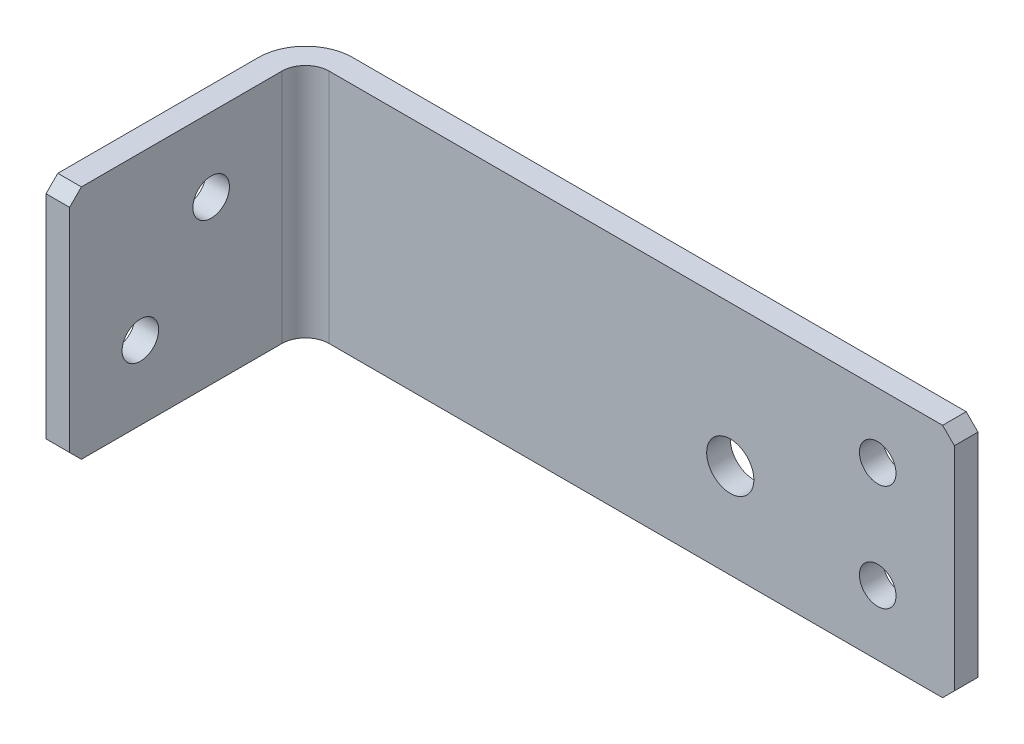
ISO-10303-21;
HEADER;
FILE_DESCRIPTION(('STEP AP214'),'2;1');
FILE_NAME('part.step','',(''),(''),'','','');
FILE_SCHEMA(('AUTOMOTIVE_DESIGN { 1 0 10303 214 1 1 1 1 }'));
ENDSEC;
DATA;
#1=APPLICATION_CONTEXT('core data for automotive mechanical design processes');
#2=APPLICATION_PROTOCOL_DEFINITION('international standard','automotive_design',2000,#1);
#3=PRODUCT_CONTEXT('',#1,'mechanical');
#4=PRODUCT('Part','Part','',(#3));
#5=PRODUCT_RELATED_PRODUCT_CATEGORY('part','',(#4));
#6=PRODUCT_DEFINITION_FORMATION('','',#4);
#7=PRODUCT_DEFINITION_CONTEXT('part definition',#1,'design');
#8=PRODUCT_DEFINITION('design','',#6,#7);
#9=PRODUCT_DEFINITION_SHAPE('','',#8);
#10=(LENGTH_UNIT() NAMED_UNIT(*) SI_UNIT(.MILLI.,.METRE.));
#11=(NAMED_UNIT(*) PLANE_ANGLE_UNIT() SI_UNIT($,.RADIAN.));
#12=(NAMED_UNIT(*) SI_UNIT($,.STERADIAN.) SOLID_ANGLE_UNIT());
#13=UNCERTAINTY_MEASURE_WITH_UNIT(LENGTH_MEASURE(1.E-05),#10,'distance_accuracy_value','');
#14=(GEOMETRIC_REPRESENTATION_CONTEXT(3) GLOBAL_UNCERTAINTY_ASSIGNED_CONTEXT((#13)) GLOBAL_UNIT_ASSIGNED_CONTEXT((#10,
#11,#12)) REPRESENTATION_CONTEXT('',''));
#15=CARTESIAN_POINT('',(0.,0.,0.));
#16=DIRECTION('',(0.,0.,1.));
#17=DIRECTION('',(1.,0.,0.));
#18=AXIS2_PLACEMENT_3D('',#15,#16,#17);
#19=CARTESIAN_POINT('',(-2.,20.,0.));
#20=DIRECTION('',(0.,0.,-1.));
#21=DIRECTION('',(-1.,0.,0.));
#22=AXIS2_PLACEMENT_3D('',#19,#20,#21);
#23=PLANE('',#22);
#24=DIRECTION('',(0.,-1.,0.));
#25=VECTOR('',#24,1.);
#26=CARTESIAN_POINT('',(-2.,20.,0.));
#27=LINE('',#26,#25);
#28=CARTESIAN_POINT('',(-2.,19.,0.));
#29=VERTEX_POINT('',#28);
#30=CARTESIAN_POINT('',(-2.,0.999999999999994,0.));
#31=VERTEX_POINT('',#30);
#32=EDGE_CURVE('E164',#29,#31,#27,.T.);
#33=ORIENTED_EDGE('',*,*,#32,.T.);
#34=DIRECTION('',(1.,0.,0.));
#35=VECTOR('',#34,1.);
#36=CARTESIAN_POINT('',(0.,0.999999999999994,0.));
#37=LINE('',#36,#35);
#38=CARTESIAN_POINT('',(0.,0.999999999999994,0.));
#39=VERTEX_POINT('',#38);
#40=EDGE_CURVE('E194',#31,#39,#37,.T.);
#41=ORIENTED_EDGE('',*,*,#40,.T.);
#42=DIRECTION('',(0.,-1.,0.));
#43=VECTOR('',#42,1.);
#44=CARTESIAN_POINT('',(0.,20.,0.));
#45=LINE('',#44,#43);
#46=CARTESIAN_POINT('',(0.,19.,0.));
#47=VERTEX_POINT('',#46);
#48=EDGE_CURVE('E147',#47,#39,#45,.T.);
#49=ORIENTED_EDGE('',*,*,#48,.F.);
#50=DIRECTION('',(-1.,0.,0.));
#51=VECTOR('',#50,1.);
#52=CARTESIAN_POINT('',(-2.,19.,0.));
#53=LINE('',#52,#51);
#54=EDGE_CURVE('E192',#47,#29,#53,.T.);
#55=ORIENTED_EDGE('',*,*,#54,.T.);
#56=EDGE_LOOP('',(#33,#41,#49,#55));
#57=FACE_BOUND('',#56,.T.);
#58=ADVANCED_FACE('F37',(#57),#23,.F.);
#59=CARTESIAN_POINT('',(0.,20.,0.));
#60=DIRECTION('',(-1.,0.,0.));
#61=DIRECTION('',(0.,0.,1.));
#62=AXIS2_PLACEMENT_3D('',#59,#60,#61);
#63=PLANE('',#62);
#64=CARTESIAN_POINT('',(0.,6.25,-6.));
#65=DIRECTION('',(-1.,0.,0.));
#66=DIRECTION('',(0.,0.,1.));
#67=AXIS2_PLACEMENT_3D('',#64,#65,#66);
#68=CIRCLE('',#67,1.55);
#69=CARTESIAN_POINT('',(0.,6.25,-4.45));
#70=VERTEX_POINT('',#69);
#71=EDGE_CURVE('E338',#70,#70,#68,.T.);
#72=ORIENTED_EDGE('',*,*,#71,.T.);
#73=EDGE_LOOP('',(#72));
#74=FACE_BOUND('',#73,.T.);
#75=CARTESIAN_POINT('',(0.,13.75,-12.));
#76=DIRECTION('',(-1.,0.,0.));
#77=DIRECTION('',(0.,0.,1.));
#78=AXIS2_PLACEMENT_3D('',#75,#76,#77);
#79=CIRCLE('',#78,1.55);
#80=CARTESIAN_POINT('',(0.,13.75,-10.45));
#81=VERTEX_POINT('',#80);
#82=EDGE_CURVE('E167',#81,#81,#79,.T.);
#83=ORIENTED_EDGE('',*,*,#82,.T.);
#84=EDGE_LOOP('',(#83));
#85=FACE_BOUND('',#84,.T.);
#86=ORIENTED_EDGE('',*,*,#48,.T.);
#87=DIRECTION('',(0.,-0.707106781186545,-0.70710678118655));
#88=VECTOR('',#87,1.);
#89=CARTESIAN_POINT('',(0.,0.999999999999994,0.));
#90=LINE('',#89,#88);
#91=CARTESIAN_POINT('',(0.,0.,-1.));
#92=VERTEX_POINT('',#91);
#93=EDGE_CURVE('E199',#39,#92,#90,.T.);
#94=ORIENTED_EDGE('',*,*,#93,.T.);
#95=DIRECTION('',(0.,0.,-1.));
#96=VECTOR('',#95,1.);
#97=CARTESIAN_POINT('',(0.,0.,0.));
#98=LINE('',#97,#96);
#99=CARTESIAN_POINT('',(0.,0.,-18.));
#100=VERTEX_POINT('',#99);
#101=EDGE_CURVE('E144',#92,#100,#98,.T.);
#102=ORIENTED_EDGE('',*,*,#101,.T.);
#103=DIRECTION('',(0.,-1.,0.));
#104=VECTOR('',#103,1.);
#105=CARTESIAN_POINT('',(0.,20.,-18.));
#106=LINE('',#105,#104);
#107=CARTESIAN_POINT('',(0.,20.,-18.));
#108=VERTEX_POINT('',#107);
#109=EDGE_CURVE('E140',#108,#100,#106,.T.);
#110=ORIENTED_EDGE('',*,*,#109,.F.);
#111=DIRECTION('',(0.,0.,-1.));
#112=VECTOR('',#111,1.);
#113=CARTESIAN_POINT('',(0.,20.,0.));
#114=LINE('',#113,#112);
#115=CARTESIAN_POINT('',(0.,20.,-0.999999999999994));
#116=VERTEX_POINT('',#115);
#117=EDGE_CURVE('E126',#116,#108,#114,.T.);
#118=ORIENTED_EDGE('',*,*,#117,.F.);
#119=DIRECTION('',(0.,0.70710678118655,-0.707106781186545));
#120=VECTOR('',#119,1.);
#121=CARTESIAN_POINT('',(0.,20.,-0.999999999999994));
#122=LINE('',#121,#120);
#123=EDGE_CURVE('E197',#116,#47,#122,.F.);
#124=ORIENTED_EDGE('',*,*,#123,.T.);
#125=EDGE_LOOP('',(#86,#94,#102,#110,#118,#124));
#126=FACE_BOUND('',#125,.T.);
#127=ADVANCED_FACE('F142',(#74,#85,#126),#63,.F.);
#128=CARTESIAN_POINT('',(2.,20.,-18.));
#129=DIRECTION('',(0.,-1.,0.));
#130=DIRECTION('',(0.,0.,-1.));
#131=AXIS2_PLACEMENT_3D('',#128,#129,#130);
#132=CYLINDRICAL_SURFACE('',#131,2.);
#133=CARTESIAN_POINT('',(2.,0.,-18.));
#134=DIRECTION('',(0.,-1.,0.));
#135=DIRECTION('',(0.,0.,-1.));
#136=AXIS2_PLACEMENT_3D('',#133,#134,#135);
#137=CIRCLE('',#136,2.);
#138=CARTESIAN_POINT('',(2.,0.,-20.));
#139=VERTEX_POINT('',#138);
#140=EDGE_CURVE('E166',#100,#139,#137,.T.);
#141=ORIENTED_EDGE('',*,*,#140,.T.);
#142=DIRECTION('',(0.,-1.,0.));
#143=VECTOR('',#142,1.);
#144=CARTESIAN_POINT('',(2.,20.,-20.));
#145=LINE('',#144,#143);
#146=CARTESIAN_POINT('',(2.,20.,-20.));
#147=VERTEX_POINT('',#146);
#148=EDGE_CURVE('E148',#147,#139,#145,.T.);
#149=ORIENTED_EDGE('',*,*,#148,.F.);
#150=CARTESIAN_POINT('',(2.,20.,-18.));
#151=DIRECTION('',(0.,-1.,0.));
#152=DIRECTION('',(0.,0.,-1.));
#153=AXIS2_PLACEMENT_3D('',#150,#151,#152);
#154=CIRCLE('',#153,2.);
#155=EDGE_CURVE('E132',#108,#147,#154,.T.);
#156=ORIENTED_EDGE('',*,*,#155,.F.);
#157=ORIENTED_EDGE('',*,*,#109,.T.);
#158=EDGE_LOOP('',(#141,#149,#156,#157));
#159=FACE_BOUND('',#158,.T.);
#160=ADVANCED_FACE('F150',(#159),#132,.F.);
#161=CARTESIAN_POINT('',(2.,20.,-20.));
#162=DIRECTION('',(0.,0.,-1.));
#163=DIRECTION('',(-1.,0.,0.));
#164=AXIS2_PLACEMENT_3D('',#161,#162,#163);
#165=PLANE('',#164);
#166=CARTESIAN_POINT('',(36.,8.,-20.));
#167=DIRECTION('',(0.,0.,-1.));
#168=DIRECTION('',(-1.,0.,0.));
#169=AXIS2_PLACEMENT_3D('',#166,#167,#168);
#170=CIRCLE('',#169,2.);
#171=CARTESIAN_POINT('',(34.,8.,-20.));
#172=VERTEX_POINT('',#171);
#173=EDGE_CURVE('E319',#172,#172,#170,.T.);
#174=ORIENTED_EDGE('',*,*,#173,.T.);
#175=EDGE_LOOP('',(#174));
#176=FACE_BOUND('',#175,.T.);
#177=CARTESIAN_POINT('',(48.5,5.5,-20.));
#178=DIRECTION('',(0.,0.,-1.));
#179=DIRECTION('',(-1.,0.,0.));
#180=AXIS2_PLACEMENT_3D('',#177,#178,#179);
#181=CIRCLE('',#180,1.55);
#182=CARTESIAN_POINT('',(46.95,5.5,-20.));
#183=VERTEX_POINT('',#182);
#184=EDGE_CURVE('E323',#183,#183,#181,.T.);
#185=ORIENTED_EDGE('',*,*,#184,.T.);
#186=EDGE_LOOP('',(#185));
#187=FACE_BOUND('',#186,.T.);
#188=CARTESIAN_POINT('',(48.5,14.5,-20.));
#189=DIRECTION('',(0.,0.,-1.));
#190=DIRECTION('',(-1.,0.,0.));
#191=AXIS2_PLACEMENT_3D('',#188,#189,#190);
#192=CIRCLE('',#191,1.55);
#193=CARTESIAN_POINT('',(46.95,14.5,-20.));
#194=VERTEX_POINT('',#193);
#195=EDGE_CURVE('E332',#194,#194,#192,.T.);
#196=ORIENTED_EDGE('',*,*,#195,.T.);
#197=EDGE_LOOP('',(#196));
#198=FACE_BOUND('',#197,.T.);
#199=DIRECTION('',(1.,0.,0.));
#200=VECTOR('',#199,1.);
#201=CARTESIAN_POINT('',(2.,0.,-20.));
#202=LINE('',#201,#200);
#203=CARTESIAN_POINT('',(54.,0.,-20.));
#204=VERTEX_POINT('',#203);
#205=EDGE_CURVE('E169',#139,#204,#202,.T.);
#206=ORIENTED_EDGE('',*,*,#205,.T.);
#207=DIRECTION('',(0.70710678118655,0.707106781186545,0.));
#208=VECTOR('',#207,1.);
#209=CARTESIAN_POINT('',(55.,0.999999999999994,-20.));
#210=LINE('',#209,#208);
#211=CARTESIAN_POINT('',(55.,0.999999999999994,-20.));
#212=VERTEX_POINT('',#211);
#213=EDGE_CURVE('E11',#204,#212,#210,.T.);
#214=ORIENTED_EDGE('',*,*,#213,.T.);
#215=DIRECTION('',(0.,-1.,0.));
#216=VECTOR('',#215,1.);
#217=CARTESIAN_POINT('',(55.,20.,-20.));
#218=LINE('',#217,#216);
#219=CARTESIAN_POINT('',(55.,19.,-20.));
#220=VERTEX_POINT('',#219);
#221=EDGE_CURVE('E188',#220,#212,#218,.T.);
#222=ORIENTED_EDGE('',*,*,#221,.F.);
#223=DIRECTION('',(0.707106781186545,-0.70710678118655,0.));
#224=VECTOR('',#223,1.);
#225=CARTESIAN_POINT('',(54.,20.,-20.));
#226=LINE('',#225,#224);
#227=CARTESIAN_POINT('',(54.,20.,-20.));
#228=VERTEX_POINT('',#227);
#229=EDGE_CURVE('E45',#220,#228,#226,.F.);
#230=ORIENTED_EDGE('',*,*,#229,.T.);
#231=DIRECTION('',(1.,0.,0.));
#232=VECTOR('',#231,1.);
#233=CARTESIAN_POINT('',(2.,20.,-20.));
#234=LINE('',#233,#232);
#235=EDGE_CURVE('E153',#147,#228,#234,.T.);
#236=ORIENTED_EDGE('',*,*,#235,.F.);
#237=ORIENTED_EDGE('',*,*,#148,.T.);
#238=EDGE_LOOP('',(#206,#214,#222,#230,#236,#237));
#239=FACE_BOUND('',#238,.T.);
#240=ADVANCED_FACE('F221',(#176,#187,#198,#239),#165,.F.);
#241=CARTESIAN_POINT('',(55.,20.,-20.));
#242=DIRECTION('',(-1.,0.,0.));
#243=DIRECTION('',(0.,0.,1.));
#244=AXIS2_PLACEMENT_3D('',#241,#242,#243);
#245=PLANE('',#244);
#246=ORIENTED_EDGE('',*,*,#221,.T.);
#247=DIRECTION('',(0.,0.,-1.));
#248=VECTOR('',#247,1.);
#249=CARTESIAN_POINT('',(55.,0.999999999999994,-22.));
#250=LINE('',#249,#248);
#251=CARTESIAN_POINT('',(55.,0.999999999999994,-22.));
#252=VERTEX_POINT('',#251);
#253=EDGE_CURVE('E214',#212,#252,#250,.T.);
#254=ORIENTED_EDGE('',*,*,#253,.T.);
#255=DIRECTION('',(0.,-1.,0.));
#256=VECTOR('',#255,1.);
#257=CARTESIAN_POINT('',(55.,20.,-22.));
#258=LINE('',#257,#256);
#259=CARTESIAN_POINT('',(55.,19.,-22.));
#260=VERTEX_POINT('',#259);
#261=EDGE_CURVE('E185',#260,#252,#258,.T.);
#262=ORIENTED_EDGE('',*,*,#261,.F.);
#263=DIRECTION('',(0.,0.,1.));
#264=VECTOR('',#263,1.);
#265=CARTESIAN_POINT('',(55.,19.,-20.));
#266=LINE('',#265,#264);
#267=EDGE_CURVE('E57',#260,#220,#266,.T.);
#268=ORIENTED_EDGE('',*,*,#267,.T.);
#269=EDGE_LOOP('',(#246,#254,#262,#268));
#270=FACE_BOUND('',#269,.T.);
#271=ADVANCED_FACE('F228',(#270),#245,.F.);
#272=CARTESIAN_POINT('',(2.,20.,-22.));
#273=DIRECTION('',(0.,0.,1.));
#274=DIRECTION('',(1.,0.,0.));
#275=AXIS2_PLACEMENT_3D('',#272,#273,#274);
#276=PLANE('',#275);
#277=CARTESIAN_POINT('',(36.,8.,-22.));
#278=DIRECTION('',(0.,0.,-1.));
#279=DIRECTION('',(-1.,0.,0.));
#280=AXIS2_PLACEMENT_3D('',#277,#278,#279);
#281=CIRCLE('',#280,2.);
#282=CARTESIAN_POINT('',(34.,8.,-22.));
#283=VERTEX_POINT('',#282);
#284=EDGE_CURVE('E316',#283,#283,#281,.T.);
#285=ORIENTED_EDGE('',*,*,#284,.F.);
#286=EDGE_LOOP('',(#285));
#287=FACE_BOUND('',#286,.T.);
#288=CARTESIAN_POINT('',(48.5,5.5,-22.));
#289=DIRECTION('',(0.,0.,-1.));
#290=DIRECTION('',(-1.,0.,0.));
#291=AXIS2_PLACEMENT_3D('',#288,#289,#290);
#292=CIRCLE('',#291,1.55);
#293=CARTESIAN_POINT('',(46.95,5.5,-22.));
#294=VERTEX_POINT('',#293);
#295=EDGE_CURVE('E320',#294,#294,#292,.T.);
#296=ORIENTED_EDGE('',*,*,#295,.F.);
#297=EDGE_LOOP('',(#296));
#298=FACE_BOUND('',#297,.T.);
#299=CARTESIAN_POINT('',(48.5,14.5,-22.));
#300=DIRECTION('',(0.,0.,-1.));
#301=DIRECTION('',(-1.,0.,0.));
#302=AXIS2_PLACEMENT_3D('',#299,#300,#301);
#303=CIRCLE('',#302,1.55);
#304=CARTESIAN_POINT('',(46.95,14.5,-22.));
#305=VERTEX_POINT('',#304);
#306=EDGE_CURVE('E329',#305,#305,#303,.T.);
#307=ORIENTED_EDGE('',*,*,#306,.F.);
#308=EDGE_LOOP('',(#307));
#309=FACE_BOUND('',#308,.T.);
#310=ORIENTED_EDGE('',*,*,#261,.T.);
#311=DIRECTION('',(-0.70710678118655,-0.707106781186545,0.));
#312=VECTOR('',#311,1.);
#313=CARTESIAN_POINT('',(55.,0.999999999999994,-22.));
#314=LINE('',#313,#312);
#315=CARTESIAN_POINT('',(54.,0.,-22.));
#316=VERTEX_POINT('',#315);
#317=EDGE_CURVE('E219',#252,#316,#314,.T.);
#318=ORIENTED_EDGE('',*,*,#317,.T.);
#319=DIRECTION('',(-1.,0.,0.));
#320=VECTOR('',#319,1.);
#321=CARTESIAN_POINT('',(2.,0.,-22.));
#322=LINE('',#321,#320);
#323=CARTESIAN_POINT('',(2.,0.,-22.));
#324=VERTEX_POINT('',#323);
#325=EDGE_CURVE('E171',#316,#324,#322,.T.);
#326=ORIENTED_EDGE('',*,*,#325,.T.);
#327=DIRECTION('',(0.,-1.,0.));
#328=VECTOR('',#327,1.);
#329=CARTESIAN_POINT('',(2.,20.,-22.));
#330=LINE('',#329,#328);
#331=CARTESIAN_POINT('',(2.,20.,-22.));
#332=VERTEX_POINT('',#331);
#333=EDGE_CURVE('E182',#332,#324,#330,.T.);
#334=ORIENTED_EDGE('',*,*,#333,.F.);
#335=DIRECTION('',(-1.,0.,0.));
#336=VECTOR('',#335,1.);
#337=CARTESIAN_POINT('',(2.,20.,-22.));
#338=LINE('',#337,#336);
#339=CARTESIAN_POINT('',(54.,20.,-22.));
#340=VERTEX_POINT('',#339);
#341=EDGE_CURVE('E155',#340,#332,#338,.T.);
#342=ORIENTED_EDGE('',*,*,#341,.F.);
#343=DIRECTION('',(-0.707106781186545,0.70710678118655,0.));
#344=VECTOR('',#343,1.);
#345=CARTESIAN_POINT('',(54.,20.,-22.));
#346=LINE('',#345,#344);
#347=EDGE_CURVE('E217',#340,#260,#346,.F.);
#348=ORIENTED_EDGE('',*,*,#347,.T.);
#349=EDGE_LOOP('',(#310,#318,#326,#334,#342,#348));
#350=FACE_BOUND('',#349,.T.);
#351=ADVANCED_FACE('F226',(#287,#298,#309,#350),#276,.F.);
#352=CARTESIAN_POINT('',(2.,20.,-18.));
#353=DIRECTION('',(0.,-1.,0.));
#354=DIRECTION('',(0.,0.,-1.));
#355=AXIS2_PLACEMENT_3D('',#352,#353,#354);
#356=CYLINDRICAL_SURFACE('',#355,4.);
#357=CARTESIAN_POINT('',(2.,0.,-18.));
#358=DIRECTION('',(0.,1.,0.));
#359=DIRECTION('',(0.,0.,-1.));
#360=AXIS2_PLACEMENT_3D('',#357,#358,#359);
#361=CIRCLE('',#360,4.);
#362=CARTESIAN_POINT('',(-2.,0.,-18.));
#363=VERTEX_POINT('',#362);
#364=EDGE_CURVE('E173',#324,#363,#361,.T.);
#365=ORIENTED_EDGE('',*,*,#364,.T.);
#366=DIRECTION('',(0.,-1.,0.));
#367=VECTOR('',#366,1.);
#368=CARTESIAN_POINT('',(-2.,20.,-18.));
#369=LINE('',#368,#367);
#370=CARTESIAN_POINT('',(-2.,20.,-18.));
#371=VERTEX_POINT('',#370);
#372=EDGE_CURVE('E179',#371,#363,#369,.T.);
#373=ORIENTED_EDGE('',*,*,#372,.F.);
#374=CARTESIAN_POINT('',(2.,20.,-18.));
#375=DIRECTION('',(0.,1.,0.));
#376=DIRECTION('',(0.,0.,-1.));
#377=AXIS2_PLACEMENT_3D('',#374,#375,#376);
#378=CIRCLE('',#377,4.);
#379=EDGE_CURVE('E160',#332,#371,#378,.T.);
#380=ORIENTED_EDGE('',*,*,#379,.F.);
#381=ORIENTED_EDGE('',*,*,#333,.T.);
#382=EDGE_LOOP('',(#365,#373,#380,#381));
#383=FACE_BOUND('',#382,.T.);
#384=ADVANCED_FACE('F241',(#383),#356,.T.);
#385=CARTESIAN_POINT('',(-2.,20.,0.));
#386=DIRECTION('',(1.,0.,0.));
#387=DIRECTION('',(0.,0.,-1.));
#388=AXIS2_PLACEMENT_3D('',#385,#386,#387);
#389=PLANE('',#388);
#390=CARTESIAN_POINT('',(-2.,6.25,-6.));
#391=DIRECTION('',(-1.,0.,0.));
#392=DIRECTION('',(0.,0.,1.));
#393=AXIS2_PLACEMENT_3D('',#390,#391,#392);
#394=CIRCLE('',#393,1.55);
#395=CARTESIAN_POINT('',(-2.,6.25,-4.45));
#396=VERTEX_POINT('',#395);
#397=EDGE_CURVE('E335',#396,#396,#394,.T.);
#398=ORIENTED_EDGE('',*,*,#397,.F.);
#399=EDGE_LOOP('',(#398));
#400=FACE_BOUND('',#399,.T.);
#401=CARTESIAN_POINT('',(-2.,13.75,-12.));
#402=DIRECTION('',(-1.,0.,0.));
#403=DIRECTION('',(0.,0.,1.));
#404=AXIS2_PLACEMENT_3D('',#401,#402,#403);
#405=CIRCLE('',#404,1.55);
#406=CARTESIAN_POINT('',(-2.,13.75,-10.45));
#407=VERTEX_POINT('',#406);
#408=EDGE_CURVE('E341',#407,#407,#405,.T.);
#409=ORIENTED_EDGE('',*,*,#408,.F.);
#410=EDGE_LOOP('',(#409));
#411=FACE_BOUND('',#410,.T.);
#412=DIRECTION('',(0.,0.,1.));
#413=VECTOR('',#412,1.);
#414=CARTESIAN_POINT('',(-2.,0.,0.));
#415=LINE('',#414,#413);
#416=CARTESIAN_POINT('',(-2.,0.,-1.));
#417=VERTEX_POINT('',#416);
#418=EDGE_CURVE('E137',#363,#417,#415,.T.);
#419=ORIENTED_EDGE('',*,*,#418,.T.);
#420=DIRECTION('',(0.,0.707106781186545,0.70710678118655));
#421=VECTOR('',#420,1.);
#422=CARTESIAN_POINT('',(-2.,0.999999999999994,0.));
#423=LINE('',#422,#421);
#424=EDGE_CURVE('E207',#417,#31,#423,.T.);
#425=ORIENTED_EDGE('',*,*,#424,.T.);
#426=ORIENTED_EDGE('',*,*,#32,.F.);
#427=DIRECTION('',(0.,-0.70710678118655,0.707106781186545));
#428=VECTOR('',#427,1.);
#429=CARTESIAN_POINT('',(-2.,20.,-0.999999999999994));
#430=LINE('',#429,#428);
#431=CARTESIAN_POINT('',(-2.,20.,-0.999999999999994));
#432=VERTEX_POINT('',#431);
#433=EDGE_CURVE('E205',#29,#432,#430,.F.);
#434=ORIENTED_EDGE('',*,*,#433,.T.);
#435=DIRECTION('',(0.,0.,1.));
#436=VECTOR('',#435,1.);
#437=CARTESIAN_POINT('',(-2.,20.,0.));
#438=LINE('',#437,#436);
#439=EDGE_CURVE('E162',#371,#432,#438,.T.);
#440=ORIENTED_EDGE('',*,*,#439,.F.);
#441=ORIENTED_EDGE('',*,*,#372,.T.);
#442=EDGE_LOOP('',(#419,#425,#426,#434,#440,#441));
#443=FACE_BOUND('',#442,.T.);
#444=ADVANCED_FACE('F245',(#400,#411,#443),#389,.F.);
#445=CARTESIAN_POINT('',(2.,20.,-18.));
#446=DIRECTION('',(0.,-1.,0.));
#447=DIRECTION('',(0.,0.,-1.));
#448=AXIS2_PLACEMENT_3D('',#445,#446,#447);
#449=PLANE('',#448);
#450=ORIENTED_EDGE('',*,*,#439,.T.);
#451=DIRECTION('',(1.,0.,0.));
#452=VECTOR('',#451,1.);
#453=CARTESIAN_POINT('',(2.,20.,-0.999999999999994));
#454=LINE('',#453,#452);
#455=EDGE_CURVE('E135',#432,#116,#454,.T.);
#456=ORIENTED_EDGE('',*,*,#455,.T.);
#457=ORIENTED_EDGE('',*,*,#117,.T.);
#458=ORIENTED_EDGE('',*,*,#155,.T.);
#459=ORIENTED_EDGE('',*,*,#235,.T.);
#460=DIRECTION('',(0.,0.,-1.));
#461=VECTOR('',#460,1.);
#462=CARTESIAN_POINT('',(54.,20.,-18.));
#463=LINE('',#462,#461);
#464=EDGE_CURVE('E209',#228,#340,#463,.T.);
#465=ORIENTED_EDGE('',*,*,#464,.T.);
#466=ORIENTED_EDGE('',*,*,#341,.T.);
#467=ORIENTED_EDGE('',*,*,#379,.T.);
#468=EDGE_LOOP('',(#450,#456,#457,#458,#459,#465,#466,#467));
#469=FACE_BOUND('',#468,.T.);
#470=ADVANCED_FACE('F129',(#469),#449,.F.);
#471=CARTESIAN_POINT('',(2.,0.,-18.));
#472=DIRECTION('',(0.,-1.,0.));
#473=DIRECTION('',(0.,0.,-1.));
#474=AXIS2_PLACEMENT_3D('',#471,#472,#473);
#475=PLANE('',#474);
#476=ORIENTED_EDGE('',*,*,#101,.F.);
#477=DIRECTION('',(-1.,0.,0.));
#478=VECTOR('',#477,1.);
#479=CARTESIAN_POINT('',(-2.,0.,-1.));
#480=LINE('',#479,#478);
#481=EDGE_CURVE('E203',#92,#417,#480,.T.);
#482=ORIENTED_EDGE('',*,*,#481,.T.);
#483=ORIENTED_EDGE('',*,*,#418,.F.);
#484=ORIENTED_EDGE('',*,*,#364,.F.);
#485=ORIENTED_EDGE('',*,*,#325,.F.);
#486=DIRECTION('',(0.,0.,1.));
#487=VECTOR('',#486,1.);
#488=CARTESIAN_POINT('',(54.,0.,-20.));
#489=LINE('',#488,#487);
#490=EDGE_CURVE('E201',#316,#204,#489,.T.);
#491=ORIENTED_EDGE('',*,*,#490,.T.);
#492=ORIENTED_EDGE('',*,*,#205,.F.);
#493=ORIENTED_EDGE('',*,*,#140,.F.);
#494=EDGE_LOOP('',(#476,#482,#483,#484,#485,#491,#492,#493));
#495=FACE_BOUND('',#494,.T.);
#496=ADVANCED_FACE('F236',(#495),#475,.T.);
#497=CARTESIAN_POINT('',(18.,13.75,-12.));
#498=DIRECTION('',(-1.,0.,0.));
#499=DIRECTION('',(0.,0.,1.));
#500=AXIS2_PLACEMENT_3D('',#497,#498,#499);
#501=CYLINDRICAL_SURFACE('',#500,1.55);
#502=ORIENTED_EDGE('',*,*,#408,.T.);
#503=EDGE_LOOP('',(#502));
#504=FACE_BOUND('',#503,.T.);
#505=ORIENTED_EDGE('',*,*,#82,.F.);
#506=EDGE_LOOP('',(#505));
#507=FACE_BOUND('',#506,.T.);
#508=ADVANCED_FACE('F294',(#504,#507),#501,.F.);
#509=CARTESIAN_POINT('',(18.,6.25,-6.));
#510=DIRECTION('',(-1.,0.,0.));
#511=DIRECTION('',(0.,0.,1.));
#512=AXIS2_PLACEMENT_3D('',#509,#510,#511);
#513=CYLINDRICAL_SURFACE('',#512,1.55);
#514=ORIENTED_EDGE('',*,*,#397,.T.);
#515=EDGE_LOOP('',(#514));
#516=FACE_BOUND('',#515,.T.);
#517=ORIENTED_EDGE('',*,*,#71,.F.);
#518=EDGE_LOOP('',(#517));
#519=FACE_BOUND('',#518,.T.);
#520=ADVANCED_FACE('F299',(#516,#519),#513,.F.);
#521=CARTESIAN_POINT('',(48.5,14.5,0.));
#522=DIRECTION('',(0.,0.,-1.));
#523=DIRECTION('',(-1.,0.,0.));
#524=AXIS2_PLACEMENT_3D('',#521,#522,#523);
#525=CYLINDRICAL_SURFACE('',#524,1.55);
#526=ORIENTED_EDGE('',*,*,#306,.T.);
#527=EDGE_LOOP('',(#526));
#528=FACE_BOUND('',#527,.T.);
#529=ORIENTED_EDGE('',*,*,#195,.F.);
#530=EDGE_LOOP('',(#529));
#531=FACE_BOUND('',#530,.T.);
#532=ADVANCED_FACE('F266',(#528,#531),#525,.F.);
#533=CARTESIAN_POINT('',(48.5,5.5,0.));
#534=DIRECTION('',(0.,0.,-1.));
#535=DIRECTION('',(-1.,0.,0.));
#536=AXIS2_PLACEMENT_3D('',#533,#534,#535);
#537=CYLINDRICAL_SURFACE('',#536,1.55);
#538=ORIENTED_EDGE('',*,*,#295,.T.);
#539=EDGE_LOOP('',(#538));
#540=FACE_BOUND('',#539,.T.);
#541=ORIENTED_EDGE('',*,*,#184,.F.);
#542=EDGE_LOOP('',(#541));
#543=FACE_BOUND('',#542,.T.);
#544=ADVANCED_FACE('F259',(#540,#543),#537,.F.);
#545=CARTESIAN_POINT('',(-2.,0.999999999999994,0.));
#546=DIRECTION('',(0.,-0.70710678118655,0.707106781186545));
#547=DIRECTION('',(-1.,0.,0.));
#548=AXIS2_PLACEMENT_3D('',#545,#546,#547);
#549=PLANE('',#548);
#550=ORIENTED_EDGE('',*,*,#424,.F.);
#551=ORIENTED_EDGE('',*,*,#481,.F.);
#552=ORIENTED_EDGE('',*,*,#93,.F.);
#553=ORIENTED_EDGE('',*,*,#40,.F.);
#554=EDGE_LOOP('',(#550,#551,#552,#553));
#555=FACE_BOUND('',#554,.T.);
#556=ADVANCED_FACE('F256',(#555),#549,.T.);
#557=CARTESIAN_POINT('',(2.,20.,-0.999999999999994));
#558=DIRECTION('',(0.,-0.707106781186545,-0.70710678118655));
#559=DIRECTION('',(1.,0.,0.));
#560=AXIS2_PLACEMENT_3D('',#557,#558,#559);
#561=PLANE('',#560);
#562=ORIENTED_EDGE('',*,*,#433,.F.);
#563=ORIENTED_EDGE('',*,*,#54,.F.);
#564=ORIENTED_EDGE('',*,*,#123,.F.);
#565=ORIENTED_EDGE('',*,*,#455,.F.);
#566=EDGE_LOOP('',(#562,#563,#564,#565));
#567=FACE_BOUND('',#566,.T.);
#568=ADVANCED_FACE('F250',(#567),#561,.F.);
#569=CARTESIAN_POINT('',(55.,0.999999999999994,-20.));
#570=DIRECTION('',(0.707106781186545,-0.70710678118655,0.));
#571=DIRECTION('',(0.,0.,1.));
#572=AXIS2_PLACEMENT_3D('',#569,#570,#571);
#573=PLANE('',#572);
#574=ORIENTED_EDGE('',*,*,#213,.F.);
#575=ORIENTED_EDGE('',*,*,#490,.F.);
#576=ORIENTED_EDGE('',*,*,#317,.F.);
#577=ORIENTED_EDGE('',*,*,#253,.F.);
#578=EDGE_LOOP('',(#574,#575,#576,#577));
#579=FACE_BOUND('',#578,.T.);
#580=ADVANCED_FACE('F231',(#579),#573,.T.);
#581=CARTESIAN_POINT('',(54.,20.,-18.));
#582=DIRECTION('',(-0.70710678118655,-0.707106781186545,0.));
#583=DIRECTION('',(0.,0.,-1.));
#584=AXIS2_PLACEMENT_3D('',#581,#582,#583);
#585=PLANE('',#584);
#586=ORIENTED_EDGE('',*,*,#229,.F.);
#587=ORIENTED_EDGE('',*,*,#267,.F.);
#588=ORIENTED_EDGE('',*,*,#347,.F.);
#589=ORIENTED_EDGE('',*,*,#464,.F.);
#590=EDGE_LOOP('',(#586,#587,#588,#589));
#591=FACE_BOUND('',#590,.T.);
#592=ADVANCED_FACE('F39',(#591),#585,.F.);
#593=CARTESIAN_POINT('',(36.,8.,0.));
#594=DIRECTION('',(0.,0.,-1.));
#595=DIRECTION('',(-1.,0.,0.));
#596=AXIS2_PLACEMENT_3D('',#593,#594,#595);
#597=CYLINDRICAL_SURFACE('',#596,2.);
#598=ORIENTED_EDGE('',*,*,#284,.T.);
#599=EDGE_LOOP('',(#598));
#600=FACE_BOUND('',#599,.T.);
#601=ORIENTED_EDGE('',*,*,#173,.F.);
#602=EDGE_LOOP('',(#601));
#603=FACE_BOUND('',#602,.T.);
#604=ADVANCED_FACE('F307',(#600,#603),#597,.F.);
#605=CLOSED_SHELL('',(#58,#127,#160,#240,#271,#351,#384,#444,#470,#496,#508,#520,#532,#544,#556,
#568,#580,#592,#604));
#606=MANIFOLD_SOLID_BREP('B2',#605);
#607=ADVANCED_BREP_SHAPE_REPRESENTATION('',(#18,#606),#14);
#608=SHAPE_DEFINITION_REPRESENTATION(#9,#607);
ENDSEC;
END-ISO-10303-21;
